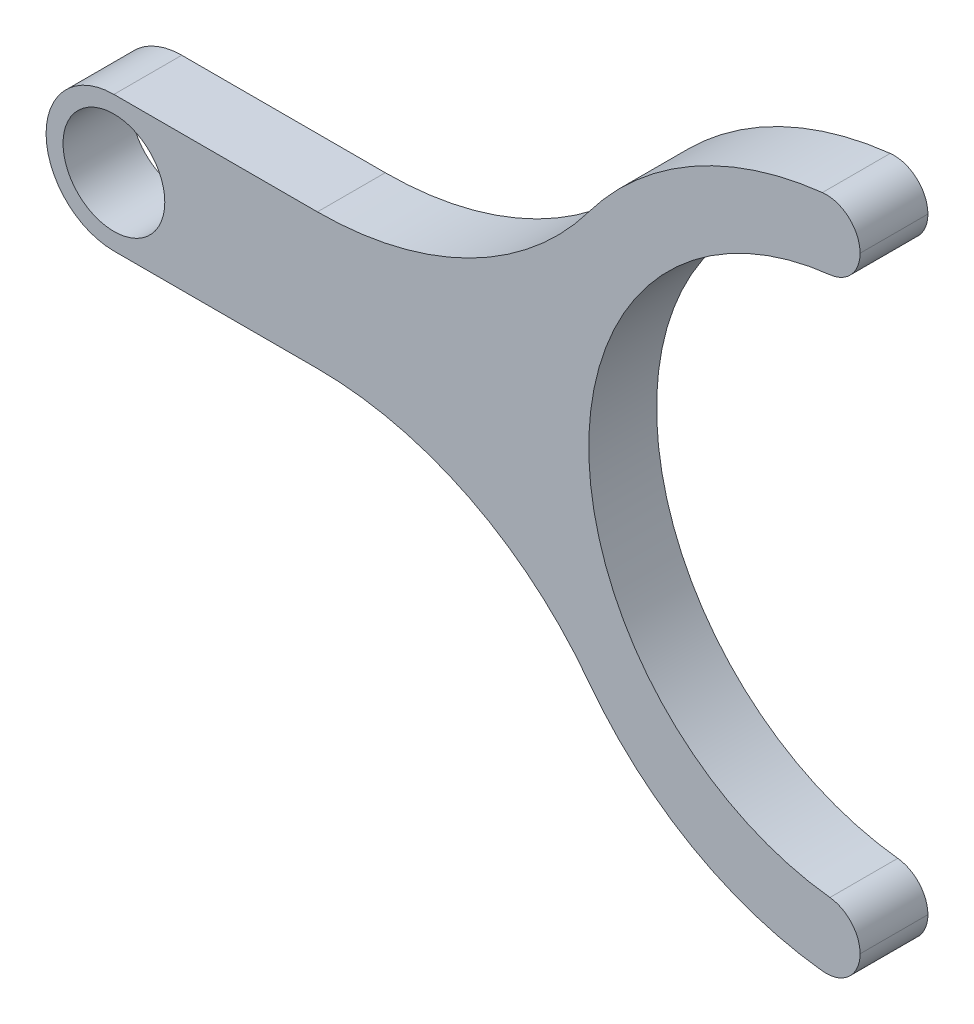
ISO-10303-21;
HEADER;
FILE_DESCRIPTION(('STEP AP214'),'2;1');
FILE_NAME('part.step','',(''),(''),'','','');
FILE_SCHEMA(('AUTOMOTIVE_DESIGN { 1 0 10303 214 1 1 1 1 }'));
ENDSEC;
DATA;
#1=APPLICATION_CONTEXT('core data for automotive mechanical design processes');
#2=APPLICATION_PROTOCOL_DEFINITION('international standard','automotive_design',2000,#1);
#3=PRODUCT_CONTEXT('',#1,'mechanical');
#4=PRODUCT('Part','Part','',(#3));
#5=PRODUCT_RELATED_PRODUCT_CATEGORY('part','',(#4));
#6=PRODUCT_DEFINITION_FORMATION('','',#4);
#7=PRODUCT_DEFINITION_CONTEXT('part definition',#1,'design');
#8=PRODUCT_DEFINITION('design','',#6,#7);
#9=PRODUCT_DEFINITION_SHAPE('','',#8);
#10=(LENGTH_UNIT() NAMED_UNIT(*) SI_UNIT(.MILLI.,.METRE.));
#11=(NAMED_UNIT(*) PLANE_ANGLE_UNIT() SI_UNIT($,.RADIAN.));
#12=(NAMED_UNIT(*) SI_UNIT($,.STERADIAN.) SOLID_ANGLE_UNIT());
#13=UNCERTAINTY_MEASURE_WITH_UNIT(LENGTH_MEASURE(1.E-05),#10,'distance_accuracy_value','');
#14=(GEOMETRIC_REPRESENTATION_CONTEXT(3) GLOBAL_UNCERTAINTY_ASSIGNED_CONTEXT((#13)) GLOBAL_UNIT_ASSIGNED_CONTEXT((#10,
#11,#12)) REPRESENTATION_CONTEXT('',''));
#15=CARTESIAN_POINT('',(0.,0.,0.));
#16=DIRECTION('',(0.,0.,1.));
#17=DIRECTION('',(1.,0.,0.));
#18=AXIS2_PLACEMENT_3D('',#15,#16,#17);
#19=CARTESIAN_POINT('',(-40.,60.,5.));
#20=DIRECTION('',(0.,0.,1.));
#21=DIRECTION('',(1.,0.,0.));
#22=AXIS2_PLACEMENT_3D('',#19,#20,#21);
#23=PLANE('',#22);
#24=CARTESIAN_POINT('',(40.,0.,5.));
#25=DIRECTION('',(0.,0.,1.));
#26=DIRECTION('',(1.,0.,0.));
#27=AXIS2_PLACEMENT_3D('',#24,#25,#26);
#28=CIRCLE('',#27,50.);
#29=CARTESIAN_POINT('',(0.,-30.0000000000001,5.));
#30=VERTEX_POINT('',#29);
#31=CARTESIAN_POINT('',(34.4444444444446,-49.6903994999953,5.));
#32=VERTEX_POINT('',#31);
#33=EDGE_CURVE('E244',#30,#32,#28,.T.);
#34=ORIENTED_EDGE('',*,*,#33,.T.);
#35=CARTESIAN_POINT('',(35.0000000000002,-44.7213595499958,5.));
#36=DIRECTION('',(0.,0.,1.));
#37=DIRECTION('',(1.,0.,0.));
#38=AXIS2_PLACEMENT_3D('',#35,#36,#37);
#39=CIRCLE('',#38,5.);
#40=CARTESIAN_POINT('',(40.0000000000002,-44.7213595499958,5.));
#41=VERTEX_POINT('',#40);
#42=EDGE_CURVE('E174',#32,#41,#39,.T.);
#43=ORIENTED_EDGE('',*,*,#42,.T.);
#44=CARTESIAN_POINT('',(35.0000000000002,-44.7213595499958,5.));
#45=DIRECTION('',(0.,0.,1.));
#46=DIRECTION('',(1.,0.,0.));
#47=AXIS2_PLACEMENT_3D('',#44,#45,#46);
#48=CIRCLE('',#47,5.);
#49=CARTESIAN_POINT('',(35.5555555555557,-39.7523195999963,5.));
#50=VERTEX_POINT('',#49);
#51=EDGE_CURVE('E172',#41,#50,#48,.T.);
#52=ORIENTED_EDGE('',*,*,#51,.T.);
#53=CARTESIAN_POINT('',(40.,0.,5.));
#54=DIRECTION('',(0.,0.,-1.));
#55=DIRECTION('',(1.,0.,0.));
#56=AXIS2_PLACEMENT_3D('',#53,#54,#55);
#57=CIRCLE('',#56,40.);
#58=CARTESIAN_POINT('',(35.5555555555554,39.7523195999963,5.));
#59=VERTEX_POINT('',#58);
#60=EDGE_CURVE('E242',#50,#59,#57,.T.);
#61=ORIENTED_EDGE('',*,*,#60,.T.);
#62=CARTESIAN_POINT('',(34.9999999999999,44.7213595499958,5.));
#63=DIRECTION('',(0.,0.,1.));
#64=DIRECTION('',(1.,0.,0.));
#65=AXIS2_PLACEMENT_3D('',#62,#63,#64);
#66=CIRCLE('',#65,5.);
#67=CARTESIAN_POINT('',(39.9999999999999,44.7213595499958,5.));
#68=VERTEX_POINT('',#67);
#69=EDGE_CURVE('E61',#59,#68,#66,.T.);
#70=ORIENTED_EDGE('',*,*,#69,.T.);
#71=CARTESIAN_POINT('',(34.9999999999999,44.7213595499958,5.));
#72=DIRECTION('',(0.,0.,1.));
#73=DIRECTION('',(1.,0.,0.));
#74=AXIS2_PLACEMENT_3D('',#71,#72,#73);
#75=CIRCLE('',#74,5.);
#76=CARTESIAN_POINT('',(34.4444444444443,49.6903994999953,5.));
#77=VERTEX_POINT('',#76);
#78=EDGE_CURVE('E56',#68,#77,#75,.T.);
#79=ORIENTED_EDGE('',*,*,#78,.T.);
#80=CARTESIAN_POINT('',(40.,0.,5.));
#81=DIRECTION('',(0.,0.,1.));
#82=DIRECTION('',(1.,0.,0.));
#83=AXIS2_PLACEMENT_3D('',#80,#81,#82);
#84=CIRCLE('',#83,50.);
#85=CARTESIAN_POINT('',(-1.11022302462516E-13,29.9999999999998,5.));
#86=VERTEX_POINT('',#85);
#87=EDGE_CURVE('E145',#77,#86,#84,.T.);
#88=ORIENTED_EDGE('',*,*,#87,.T.);
#89=CARTESIAN_POINT('',(-40.,60.,5.));
#90=DIRECTION('',(0.,0.,-1.));
#91=DIRECTION('',(1.,0.,0.));
#92=AXIS2_PLACEMENT_3D('',#89,#90,#91);
#93=CIRCLE('',#92,50.);
#94=CARTESIAN_POINT('',(-40.,9.99999999999999,5.));
#95=VERTEX_POINT('',#94);
#96=EDGE_CURVE('E140',#86,#95,#93,.T.);
#97=ORIENTED_EDGE('',*,*,#96,.T.);
#98=DIRECTION('',(-1.,0.,0.));
#99=VECTOR('',#98,1.);
#100=CARTESIAN_POINT('',(-40.,9.99999999999999,5.));
#101=LINE('',#100,#99);
#102=CARTESIAN_POINT('',(-70.,10.,5.));
#103=VERTEX_POINT('',#102);
#104=EDGE_CURVE('E130',#95,#103,#101,.T.);
#105=ORIENTED_EDGE('',*,*,#104,.T.);
#106=CARTESIAN_POINT('',(-70.,0.,5.));
#107=DIRECTION('',(0.,0.,1.));
#108=DIRECTION('',(1.,0.,0.));
#109=AXIS2_PLACEMENT_3D('',#106,#107,#108);
#110=CIRCLE('',#109,10.);
#111=CARTESIAN_POINT('',(-70.,-10.,5.));
#112=VERTEX_POINT('',#111);
#113=EDGE_CURVE('E139',#103,#112,#110,.T.);
#114=ORIENTED_EDGE('',*,*,#113,.T.);
#115=DIRECTION('',(1.,0.,0.));
#116=VECTOR('',#115,1.);
#117=CARTESIAN_POINT('',(-40.,-9.99999999999999,5.));
#118=LINE('',#117,#116);
#119=CARTESIAN_POINT('',(-40.,-9.99999999999999,5.));
#120=VERTEX_POINT('',#119);
#121=EDGE_CURVE('E229',#112,#120,#118,.T.);
#122=ORIENTED_EDGE('',*,*,#121,.T.);
#123=CARTESIAN_POINT('',(-40.,-60.,5.));
#124=DIRECTION('',(0.,0.,-1.));
#125=DIRECTION('',(-1.,0.,0.));
#126=AXIS2_PLACEMENT_3D('',#123,#124,#125);
#127=CIRCLE('',#126,50.);
#128=EDGE_CURVE('E246',#120,#30,#127,.T.);
#129=ORIENTED_EDGE('',*,*,#128,.T.);
#130=EDGE_LOOP('',(#34,#43,#52,#61,#70,#79,#88,#97,#105,#114,#122,#129));
#131=FACE_BOUND('',#130,.T.);
#132=CARTESIAN_POINT('',(-70.,0.,5.));
#133=DIRECTION('',(0.,0.,1.));
#134=DIRECTION('',(1.,0.,0.));
#135=AXIS2_PLACEMENT_3D('',#132,#133,#134);
#136=CIRCLE('',#135,7.50000000000001);
#137=CARTESIAN_POINT('',(-62.5,0.,5.));
#138=VERTEX_POINT('',#137);
#139=EDGE_CURVE('E185',#138,#138,#136,.T.);
#140=ORIENTED_EDGE('',*,*,#139,.F.);
#141=EDGE_LOOP('',(#140));
#142=FACE_BOUND('',#141,.T.);
#143=ADVANCED_FACE('F39',(#131,#142),#23,.T.);
#144=CARTESIAN_POINT('',(-40.,60.,-5.));
#145=DIRECTION('',(0.,0.,1.));
#146=DIRECTION('',(1.,0.,0.));
#147=AXIS2_PLACEMENT_3D('',#144,#145,#146);
#148=PLANE('',#147);
#149=CARTESIAN_POINT('',(35.0000000000002,-44.7213595499958,-5.));
#150=DIRECTION('',(0.,0.,1.));
#151=DIRECTION('',(1.,0.,0.));
#152=AXIS2_PLACEMENT_3D('',#149,#150,#151);
#153=CIRCLE('',#152,5.);
#154=CARTESIAN_POINT('',(35.5555555555557,-39.7523195999963,-5.));
#155=VERTEX_POINT('',#154);
#156=CARTESIAN_POINT('',(40.0000000000002,-44.7213595499958,-5.));
#157=VERTEX_POINT('',#156);
#158=EDGE_CURVE('E163',#155,#157,#153,.F.);
#159=ORIENTED_EDGE('',*,*,#158,.T.);
#160=CARTESIAN_POINT('',(35.0000000000002,-44.7213595499958,-5.));
#161=DIRECTION('',(0.,0.,1.));
#162=DIRECTION('',(1.,0.,0.));
#163=AXIS2_PLACEMENT_3D('',#160,#161,#162);
#164=CIRCLE('',#163,5.);
#165=CARTESIAN_POINT('',(34.4444444444446,-49.6903994999953,-5.));
#166=VERTEX_POINT('',#165);
#167=EDGE_CURVE('E165',#157,#166,#164,.F.);
#168=ORIENTED_EDGE('',*,*,#167,.T.);
#169=CARTESIAN_POINT('',(40.,0.,-5.));
#170=DIRECTION('',(0.,0.,1.));
#171=DIRECTION('',(1.,0.,0.));
#172=AXIS2_PLACEMENT_3D('',#169,#170,#171);
#173=CIRCLE('',#172,50.);
#174=CARTESIAN_POINT('',(0.,-30.0000000000001,-5.));
#175=VERTEX_POINT('',#174);
#176=EDGE_CURVE('E206',#175,#166,#173,.T.);
#177=ORIENTED_EDGE('',*,*,#176,.F.);
#178=CARTESIAN_POINT('',(-40.,-60.,-5.));
#179=DIRECTION('',(0.,0.,-1.));
#180=DIRECTION('',(-1.,0.,0.));
#181=AXIS2_PLACEMENT_3D('',#178,#179,#180);
#182=CIRCLE('',#181,50.);
#183=CARTESIAN_POINT('',(-40.,-9.99999999999999,-5.));
#184=VERTEX_POINT('',#183);
#185=EDGE_CURVE('E210',#184,#175,#182,.T.);
#186=ORIENTED_EDGE('',*,*,#185,.F.);
#187=DIRECTION('',(1.,0.,0.));
#188=VECTOR('',#187,1.);
#189=CARTESIAN_POINT('',(-40.,-9.99999999999999,-5.));
#190=LINE('',#189,#188);
#191=CARTESIAN_POINT('',(-70.,-10.,-5.));
#192=VERTEX_POINT('',#191);
#193=EDGE_CURVE('E228',#192,#184,#190,.T.);
#194=ORIENTED_EDGE('',*,*,#193,.F.);
#195=CARTESIAN_POINT('',(-70.,0.,-5.));
#196=DIRECTION('',(0.,0.,1.));
#197=DIRECTION('',(1.,0.,0.));
#198=AXIS2_PLACEMENT_3D('',#195,#196,#197);
#199=CIRCLE('',#198,10.);
#200=CARTESIAN_POINT('',(-70.,10.,-5.));
#201=VERTEX_POINT('',#200);
#202=EDGE_CURVE('E233',#201,#192,#199,.T.);
#203=ORIENTED_EDGE('',*,*,#202,.F.);
#204=DIRECTION('',(-1.,0.,0.));
#205=VECTOR('',#204,1.);
#206=CARTESIAN_POINT('',(-40.,9.99999999999999,-5.));
#207=LINE('',#206,#205);
#208=CARTESIAN_POINT('',(-40.,9.99999999999999,-5.));
#209=VERTEX_POINT('',#208);
#210=EDGE_CURVE('E236',#209,#201,#207,.T.);
#211=ORIENTED_EDGE('',*,*,#210,.F.);
#212=CARTESIAN_POINT('',(-40.,60.,-5.));
#213=DIRECTION('',(0.,0.,-1.));
#214=DIRECTION('',(1.,0.,0.));
#215=AXIS2_PLACEMENT_3D('',#212,#213,#214);
#216=CIRCLE('',#215,50.);
#217=CARTESIAN_POINT('',(-1.11022302462516E-13,29.9999999999998,-5.));
#218=VERTEX_POINT('',#217);
#219=EDGE_CURVE('E153',#218,#209,#216,.T.);
#220=ORIENTED_EDGE('',*,*,#219,.F.);
#221=CARTESIAN_POINT('',(40.,0.,-5.));
#222=DIRECTION('',(0.,0.,1.));
#223=DIRECTION('',(1.,0.,0.));
#224=AXIS2_PLACEMENT_3D('',#221,#222,#223);
#225=CIRCLE('',#224,50.);
#226=CARTESIAN_POINT('',(34.4444444444443,49.6903994999953,-5.));
#227=VERTEX_POINT('',#226);
#228=EDGE_CURVE('E149',#227,#218,#225,.T.);
#229=ORIENTED_EDGE('',*,*,#228,.F.);
#230=CARTESIAN_POINT('',(34.9999999999999,44.7213595499958,-5.));
#231=DIRECTION('',(0.,0.,1.));
#232=DIRECTION('',(1.,0.,0.));
#233=AXIS2_PLACEMENT_3D('',#230,#231,#232);
#234=CIRCLE('',#233,5.);
#235=CARTESIAN_POINT('',(39.9999999999999,44.7213595499958,-5.));
#236=VERTEX_POINT('',#235);
#237=EDGE_CURVE('E156',#227,#236,#234,.F.);
#238=ORIENTED_EDGE('',*,*,#237,.T.);
#239=CARTESIAN_POINT('',(34.9999999999999,44.7213595499958,-5.));
#240=DIRECTION('',(0.,0.,1.));
#241=DIRECTION('',(1.,0.,0.));
#242=AXIS2_PLACEMENT_3D('',#239,#240,#241);
#243=CIRCLE('',#242,5.);
#244=CARTESIAN_POINT('',(35.5555555555554,39.7523195999963,-5.));
#245=VERTEX_POINT('',#244);
#246=EDGE_CURVE('E154',#236,#245,#243,.F.);
#247=ORIENTED_EDGE('',*,*,#246,.T.);
#248=CARTESIAN_POINT('',(40.,0.,-5.));
#249=DIRECTION('',(0.,0.,-1.));
#250=DIRECTION('',(1.,0.,0.));
#251=AXIS2_PLACEMENT_3D('',#248,#249,#250);
#252=CIRCLE('',#251,40.);
#253=EDGE_CURVE('E199',#155,#245,#252,.T.);
#254=ORIENTED_EDGE('',*,*,#253,.F.);
#255=EDGE_LOOP('',(#159,#168,#177,#186,#194,#203,#211,#220,#229,#238,#247,#254));
#256=FACE_BOUND('',#255,.T.);
#257=CARTESIAN_POINT('',(-70.,0.,-5.));
#258=DIRECTION('',(0.,0.,1.));
#259=DIRECTION('',(1.,0.,0.));
#260=AXIS2_PLACEMENT_3D('',#257,#258,#259);
#261=CIRCLE('',#260,7.50000000000001);
#262=CARTESIAN_POINT('',(-62.5,0.,-5.));
#263=VERTEX_POINT('',#262);
#264=EDGE_CURVE('E180',#263,#263,#261,.T.);
#265=ORIENTED_EDGE('',*,*,#264,.T.);
#266=EDGE_LOOP('',(#265));
#267=FACE_BOUND('',#266,.T.);
#268=ADVANCED_FACE('F197',(#256,#267),#148,.F.);
#269=CARTESIAN_POINT('',(-40.,60.,5.));
#270=DIRECTION('',(0.,0.,-1.));
#271=DIRECTION('',(-1.,0.,0.));
#272=AXIS2_PLACEMENT_3D('',#269,#270,#271);
#273=CYLINDRICAL_SURFACE('',#272,50.);
#274=ORIENTED_EDGE('',*,*,#219,.T.);
#275=DIRECTION('',(0.,0.,-1.));
#276=VECTOR('',#275,1.);
#277=CARTESIAN_POINT('',(-40.,9.99999999999999,5.));
#278=LINE('',#277,#276);
#279=EDGE_CURVE('E134',#95,#209,#278,.T.);
#280=ORIENTED_EDGE('',*,*,#279,.F.);
#281=ORIENTED_EDGE('',*,*,#96,.F.);
#282=DIRECTION('',(0.,0.,-1.));
#283=VECTOR('',#282,1.);
#284=CARTESIAN_POINT('',(-1.11022302462516E-13,29.9999999999998,5.));
#285=LINE('',#284,#283);
#286=EDGE_CURVE('E214',#86,#218,#285,.T.);
#287=ORIENTED_EDGE('',*,*,#286,.T.);
#288=EDGE_LOOP('',(#274,#280,#281,#287));
#289=FACE_BOUND('',#288,.T.);
#290=ADVANCED_FACE('F151',(#289),#273,.F.);
#291=CARTESIAN_POINT('',(-40.,9.99999999999999,5.));
#292=DIRECTION('',(0.,-1.,0.));
#293=DIRECTION('',(1.,0.,0.));
#294=AXIS2_PLACEMENT_3D('',#291,#292,#293);
#295=PLANE('',#294);
#296=ORIENTED_EDGE('',*,*,#210,.T.);
#297=DIRECTION('',(0.,0.,-1.));
#298=VECTOR('',#297,1.);
#299=CARTESIAN_POINT('',(-70.,10.,5.));
#300=LINE('',#299,#298);
#301=EDGE_CURVE('E137',#103,#201,#300,.T.);
#302=ORIENTED_EDGE('',*,*,#301,.F.);
#303=ORIENTED_EDGE('',*,*,#104,.F.);
#304=ORIENTED_EDGE('',*,*,#279,.T.);
#305=EDGE_LOOP('',(#296,#302,#303,#304));
#306=FACE_BOUND('',#305,.T.);
#307=ADVANCED_FACE('F132',(#306),#295,.F.);
#308=CARTESIAN_POINT('',(-70.,0.,5.));
#309=DIRECTION('',(0.,0.,-1.));
#310=DIRECTION('',(-1.,0.,0.));
#311=AXIS2_PLACEMENT_3D('',#308,#309,#310);
#312=CYLINDRICAL_SURFACE('',#311,10.);
#313=ORIENTED_EDGE('',*,*,#202,.T.);
#314=DIRECTION('',(0.,0.,-1.));
#315=VECTOR('',#314,1.);
#316=CARTESIAN_POINT('',(-70.,-10.,5.));
#317=LINE('',#316,#315);
#318=EDGE_CURVE('E158',#112,#192,#317,.T.);
#319=ORIENTED_EDGE('',*,*,#318,.F.);
#320=ORIENTED_EDGE('',*,*,#113,.F.);
#321=ORIENTED_EDGE('',*,*,#301,.T.);
#322=EDGE_LOOP('',(#313,#319,#320,#321));
#323=FACE_BOUND('',#322,.T.);
#324=ADVANCED_FACE('F280',(#323),#312,.T.);
#325=CARTESIAN_POINT('',(-40.,-9.99999999999999,5.));
#326=DIRECTION('',(0.,1.,0.));
#327=DIRECTION('',(-1.,0.,0.));
#328=AXIS2_PLACEMENT_3D('',#325,#326,#327);
#329=PLANE('',#328);
#330=ORIENTED_EDGE('',*,*,#193,.T.);
#331=DIRECTION('',(0.,0.,-1.));
#332=VECTOR('',#331,1.);
#333=CARTESIAN_POINT('',(-40.,-9.99999999999999,5.));
#334=LINE('',#333,#332);
#335=EDGE_CURVE('E219',#120,#184,#334,.T.);
#336=ORIENTED_EDGE('',*,*,#335,.F.);
#337=ORIENTED_EDGE('',*,*,#121,.F.);
#338=ORIENTED_EDGE('',*,*,#318,.T.);
#339=EDGE_LOOP('',(#330,#336,#337,#338));
#340=FACE_BOUND('',#339,.T.);
#341=ADVANCED_FACE('F226',(#340),#329,.F.);
#342=CARTESIAN_POINT('',(-40.,-60.,5.));
#343=DIRECTION('',(0.,0.,-1.));
#344=DIRECTION('',(-1.,0.,0.));
#345=AXIS2_PLACEMENT_3D('',#342,#343,#344);
#346=CYLINDRICAL_SURFACE('',#345,50.);
#347=ORIENTED_EDGE('',*,*,#185,.T.);
#348=DIRECTION('',(0.,0.,-1.));
#349=VECTOR('',#348,1.);
#350=CARTESIAN_POINT('',(0.,-30.0000000000001,5.));
#351=LINE('',#350,#349);
#352=EDGE_CURVE('E216',#30,#175,#351,.T.);
#353=ORIENTED_EDGE('',*,*,#352,.F.);
#354=ORIENTED_EDGE('',*,*,#128,.F.);
#355=ORIENTED_EDGE('',*,*,#335,.T.);
#356=EDGE_LOOP('',(#347,#353,#354,#355));
#357=FACE_BOUND('',#356,.T.);
#358=ADVANCED_FACE('F273',(#357),#346,.F.);
#359=CARTESIAN_POINT('',(40.,0.,5.));
#360=DIRECTION('',(0.,0.,-1.));
#361=DIRECTION('',(-1.,0.,0.));
#362=AXIS2_PLACEMENT_3D('',#359,#360,#361);
#363=CYLINDRICAL_SURFACE('',#362,50.);
#364=ORIENTED_EDGE('',*,*,#176,.T.);
#365=DIRECTION('',(0.,0.,-1.));
#366=VECTOR('',#365,1.);
#367=CARTESIAN_POINT('',(34.4444444444446,-49.6903994999953,5.));
#368=LINE('',#367,#366);
#369=EDGE_CURVE('E167',#166,#32,#368,.F.);
#370=ORIENTED_EDGE('',*,*,#369,.T.);
#371=ORIENTED_EDGE('',*,*,#33,.F.);
#372=ORIENTED_EDGE('',*,*,#352,.T.);
#373=EDGE_LOOP('',(#364,#370,#371,#372));
#374=FACE_BOUND('',#373,.T.);
#375=ADVANCED_FACE('F270',(#374),#363,.T.);
#376=CARTESIAN_POINT('',(40.,0.,5.));
#377=DIRECTION('',(0.,0.,-1.));
#378=DIRECTION('',(-1.,0.,0.));
#379=AXIS2_PLACEMENT_3D('',#376,#377,#378);
#380=CYLINDRICAL_SURFACE('',#379,40.);
#381=ORIENTED_EDGE('',*,*,#60,.F.);
#382=DIRECTION('',(0.,0.,-1.));
#383=VECTOR('',#382,1.);
#384=CARTESIAN_POINT('',(35.5555555555557,-39.7523195999963,5.));
#385=LINE('',#384,#383);
#386=EDGE_CURVE('E48',#50,#155,#385,.T.);
#387=ORIENTED_EDGE('',*,*,#386,.T.);
#388=ORIENTED_EDGE('',*,*,#253,.T.);
#389=DIRECTION('',(0.,0.,-1.));
#390=VECTOR('',#389,1.);
#391=CARTESIAN_POINT('',(35.5555555555554,39.7523195999963,5.));
#392=LINE('',#391,#390);
#393=EDGE_CURVE('E176',#245,#59,#392,.F.);
#394=ORIENTED_EDGE('',*,*,#393,.T.);
#395=EDGE_LOOP('',(#381,#387,#388,#394));
#396=FACE_BOUND('',#395,.T.);
#397=ADVANCED_FACE('F204',(#396),#380,.F.);
#398=CARTESIAN_POINT('',(40.,0.,5.));
#399=DIRECTION('',(0.,0.,-1.));
#400=DIRECTION('',(-1.,0.,0.));
#401=AXIS2_PLACEMENT_3D('',#398,#399,#400);
#402=CYLINDRICAL_SURFACE('',#401,50.);
#403=ORIENTED_EDGE('',*,*,#87,.F.);
#404=DIRECTION('',(0.,0.,-1.));
#405=VECTOR('',#404,1.);
#406=CARTESIAN_POINT('',(34.4444444444443,49.6903994999953,5.));
#407=LINE('',#406,#405);
#408=EDGE_CURVE('E11',#77,#227,#407,.T.);
#409=ORIENTED_EDGE('',*,*,#408,.T.);
#410=ORIENTED_EDGE('',*,*,#228,.T.);
#411=ORIENTED_EDGE('',*,*,#286,.F.);
#412=EDGE_LOOP('',(#403,#409,#410,#411));
#413=FACE_BOUND('',#412,.T.);
#414=ADVANCED_FACE('F264',(#413),#402,.T.);
#415=CARTESIAN_POINT('',(-70.,0.,5.));
#416=DIRECTION('',(0.,0.,-1.));
#417=DIRECTION('',(-1.,0.,0.));
#418=AXIS2_PLACEMENT_3D('',#415,#416,#417);
#419=CYLINDRICAL_SURFACE('',#418,7.50000000000001);
#420=ORIENTED_EDGE('',*,*,#139,.T.);
#421=EDGE_LOOP('',(#420));
#422=FACE_BOUND('',#421,.T.);
#423=ORIENTED_EDGE('',*,*,#264,.F.);
#424=EDGE_LOOP('',(#423));
#425=FACE_BOUND('',#424,.T.);
#426=ADVANCED_FACE('F253',(#422,#425),#419,.F.);
#427=CARTESIAN_POINT('',(35.0000000000002,-44.7213595499958,5.));
#428=DIRECTION('',(0.,0.,-1.));
#429=DIRECTION('',(-1.,0.,0.));
#430=AXIS2_PLACEMENT_3D('',#427,#428,#429);
#431=CYLINDRICAL_SURFACE('',#430,5.);
#432=ORIENTED_EDGE('',*,*,#386,.F.);
#433=ORIENTED_EDGE('',*,*,#51,.F.);
#434=DIRECTION('',(0.,0.,-1.));
#435=VECTOR('',#434,1.);
#436=CARTESIAN_POINT('',(40.0000000000002,-44.7213595499958,5.));
#437=LINE('',#436,#435);
#438=EDGE_CURVE('E178',#157,#41,#437,.F.);
#439=ORIENTED_EDGE('',*,*,#438,.F.);
#440=ORIENTED_EDGE('',*,*,#158,.F.);
#441=EDGE_LOOP('',(#432,#433,#439,#440));
#442=FACE_BOUND('',#441,.T.);
#443=ADVANCED_FACE('F290',(#442),#431,.T.);
#444=CARTESIAN_POINT('',(35.0000000000002,-44.7213595499958,5.));
#445=DIRECTION('',(0.,0.,-1.));
#446=DIRECTION('',(-1.,0.,0.));
#447=AXIS2_PLACEMENT_3D('',#444,#445,#446);
#448=CYLINDRICAL_SURFACE('',#447,5.);
#449=ORIENTED_EDGE('',*,*,#42,.F.);
#450=ORIENTED_EDGE('',*,*,#369,.F.);
#451=ORIENTED_EDGE('',*,*,#167,.F.);
#452=ORIENTED_EDGE('',*,*,#438,.T.);
#453=EDGE_LOOP('',(#449,#450,#451,#452));
#454=FACE_BOUND('',#453,.T.);
#455=ADVANCED_FACE('F287',(#454),#448,.T.);
#456=CARTESIAN_POINT('',(34.9999999999999,44.7213595499958,5.));
#457=DIRECTION('',(0.,0.,-1.));
#458=DIRECTION('',(-1.,0.,0.));
#459=AXIS2_PLACEMENT_3D('',#456,#457,#458);
#460=CYLINDRICAL_SURFACE('',#459,5.);
#461=DIRECTION('',(0.,0.,-1.));
#462=VECTOR('',#461,1.);
#463=CARTESIAN_POINT('',(39.9999999999999,44.7213595499958,5.));
#464=LINE('',#463,#462);
#465=EDGE_CURVE('E43',#68,#236,#464,.T.);
#466=ORIENTED_EDGE('',*,*,#465,.F.);
#467=ORIENTED_EDGE('',*,*,#69,.F.);
#468=ORIENTED_EDGE('',*,*,#393,.F.);
#469=ORIENTED_EDGE('',*,*,#246,.F.);
#470=EDGE_LOOP('',(#466,#467,#468,#469));
#471=FACE_BOUND('',#470,.T.);
#472=ADVANCED_FACE('F41',(#471),#460,.T.);
#473=CARTESIAN_POINT('',(34.9999999999999,44.7213595499958,5.));
#474=DIRECTION('',(0.,0.,-1.));
#475=DIRECTION('',(-1.,0.,0.));
#476=AXIS2_PLACEMENT_3D('',#473,#474,#475);
#477=CYLINDRICAL_SURFACE('',#476,5.);
#478=ORIENTED_EDGE('',*,*,#78,.F.);
#479=ORIENTED_EDGE('',*,*,#465,.T.);
#480=ORIENTED_EDGE('',*,*,#237,.F.);
#481=ORIENTED_EDGE('',*,*,#408,.F.);
#482=EDGE_LOOP('',(#478,#479,#480,#481));
#483=FACE_BOUND('',#482,.T.);
#484=ADVANCED_FACE('F189',(#483),#477,.T.);
#485=CLOSED_SHELL('',(#143,#268,#290,#307,#324,#341,#358,#375,#397,#414,#426,#443,#455,#472,#484));
#486=MANIFOLD_SOLID_BREP('B2',#485);
#487=ADVANCED_BREP_SHAPE_REPRESENTATION('',(#18,#486),#14);
#488=SHAPE_DEFINITION_REPRESENTATION(#9,#487);
ENDSEC;
END-ISO-10303-21;
